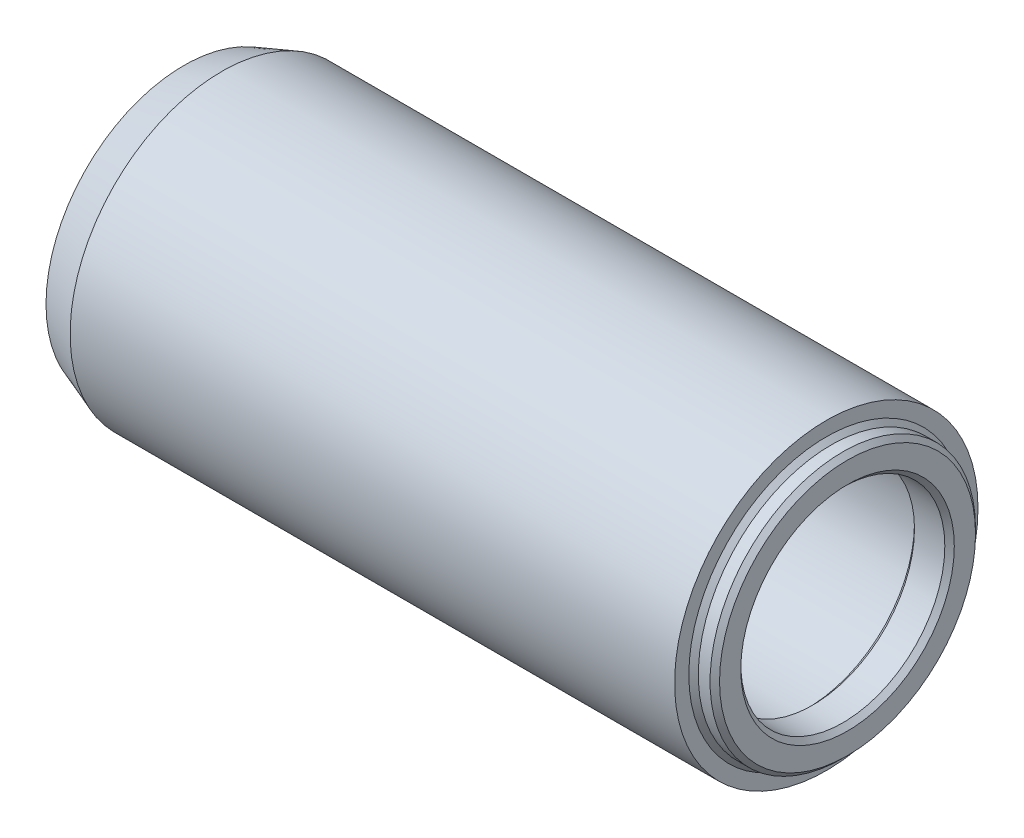
ISO-10303-21;
HEADER;
FILE_DESCRIPTION(('STEP AP214'),'2;1');
FILE_NAME('part.step','',(''),(''),'','','');
FILE_SCHEMA(('AUTOMOTIVE_DESIGN { 1 0 10303 214 1 1 1 1 }'));
ENDSEC;
DATA;
#1=APPLICATION_CONTEXT('core data for automotive mechanical design processes');
#2=APPLICATION_PROTOCOL_DEFINITION('international standard','automotive_design',2000,#1);
#3=PRODUCT_CONTEXT('',#1,'mechanical');
#4=PRODUCT('Part','Part','',(#3));
#5=PRODUCT_RELATED_PRODUCT_CATEGORY('part','',(#4));
#6=PRODUCT_DEFINITION_FORMATION('','',#4);
#7=PRODUCT_DEFINITION_CONTEXT('part definition',#1,'design');
#8=PRODUCT_DEFINITION('design','',#6,#7);
#9=PRODUCT_DEFINITION_SHAPE('','',#8);
#10=(LENGTH_UNIT() NAMED_UNIT(*) SI_UNIT(.MILLI.,.METRE.));
#11=(NAMED_UNIT(*) PLANE_ANGLE_UNIT() SI_UNIT($,.RADIAN.));
#12=(NAMED_UNIT(*) SI_UNIT($,.STERADIAN.) SOLID_ANGLE_UNIT());
#13=UNCERTAINTY_MEASURE_WITH_UNIT(LENGTH_MEASURE(1.E-05),#10,'distance_accuracy_value','');
#14=(GEOMETRIC_REPRESENTATION_CONTEXT(3) GLOBAL_UNCERTAINTY_ASSIGNED_CONTEXT((#13)) GLOBAL_UNIT_ASSIGNED_CONTEXT((#10,
#11,#12)) REPRESENTATION_CONTEXT('',''));
#15=CARTESIAN_POINT('',(0.,0.,0.));
#16=DIRECTION('',(0.,0.,1.));
#17=DIRECTION('',(1.,0.,0.));
#18=AXIS2_PLACEMENT_3D('',#15,#16,#17);
#19=CARTESIAN_POINT('',(-0.979823495601662,6.,0.));
#20=DIRECTION('',(-1.,0.,0.));
#21=DIRECTION('',(0.,0.,1.));
#22=AXIS2_PLACEMENT_3D('',#19,#20,#21);
#23=PLANE('',#22);
#24=CARTESIAN_POINT('',(-0.979823495601662,0.,0.));
#25=DIRECTION('',(-1.,0.,0.));
#26=DIRECTION('',(0.,0.,1.));
#27=AXIS2_PLACEMENT_3D('',#24,#25,#26);
#28=CIRCLE('',#27,5.75);
#29=CARTESIAN_POINT('',(-0.979823495601662,0.,5.75));
#30=VERTEX_POINT('',#29);
#31=EDGE_CURVE('E10',#30,#30,#28,.T.);
#32=ORIENTED_EDGE('',*,*,#31,.T.);
#33=EDGE_LOOP('',(#32));
#34=FACE_BOUND('',#33,.T.);
#35=CARTESIAN_POINT('',(-0.979823495601662,0.,0.));
#36=DIRECTION('',(-1.,0.,0.));
#37=DIRECTION('',(0.,0.,1.));
#38=AXIS2_PLACEMENT_3D('',#35,#36,#37);
#39=CIRCLE('',#38,5.6304532351823);
#40=CARTESIAN_POINT('',(-0.979823495601662,0.,5.6304532351823));
#41=VERTEX_POINT('',#40);
#42=EDGE_CURVE('E97',#41,#41,#39,.F.);
#43=ORIENTED_EDGE('',*,*,#42,.T.);
#44=EDGE_LOOP('',(#43));
#45=FACE_BOUND('',#44,.T.);
#46=ADVANCED_FACE('F43',(#34,#45),#23,.T.);
#47=CARTESIAN_POINT('',(0.,0.,0.));
#48=DIRECTION('',(1.,0.,0.));
#49=DIRECTION('',(0.,0.,-1.));
#50=AXIS2_PLACEMENT_3D('',#47,#48,#49);
#51=CYLINDRICAL_SURFACE('',#50,6.);
#52=CARTESIAN_POINT('',(-1.22982349560166,0.,0.));
#53=DIRECTION('',(-1.,0.,0.));
#54=DIRECTION('',(0.,0.,1.));
#55=AXIS2_PLACEMENT_3D('',#52,#53,#54);
#56=CIRCLE('',#55,6.);
#57=CARTESIAN_POINT('',(-1.22982349560166,0.,6.));
#58=VERTEX_POINT('',#57);
#59=EDGE_CURVE('E51',#58,#58,#56,.F.);
#60=ORIENTED_EDGE('',*,*,#59,.T.);
#61=EDGE_LOOP('',(#60));
#62=FACE_BOUND('',#61,.T.);
#63=CARTESIAN_POINT('',(-33.62745169,0.,0.));
#64=DIRECTION('',(-1.,0.,0.));
#65=DIRECTION('',(0.,0.,1.));
#66=AXIS2_PLACEMENT_3D('',#63,#64,#65);
#67=CIRCLE('',#66,6.);
#68=CARTESIAN_POINT('',(-33.62745169,0.,6.));
#69=VERTEX_POINT('',#68);
#70=EDGE_CURVE('E59',#69,#69,#67,.T.);
#71=ORIENTED_EDGE('',*,*,#70,.T.);
#72=EDGE_LOOP('',(#71));
#73=FACE_BOUND('',#72,.T.);
#74=ADVANCED_FACE('F134',(#62,#73),#51,.F.);
#75=CARTESIAN_POINT('',(-33.87745169,7.27205953146759,0.));
#76=DIRECTION('',(-1.,0.,0.));
#77=DIRECTION('',(0.,0.,1.));
#78=AXIS2_PLACEMENT_3D('',#75,#76,#77);
#79=PLANE('',#78);
#80=CARTESIAN_POINT('',(-33.87745169,0.,0.));
#81=DIRECTION('',(-1.,0.,0.));
#82=DIRECTION('',(0.,0.,1.));
#83=AXIS2_PLACEMENT_3D('',#80,#81,#82);
#84=CIRCLE('',#83,6.25);
#85=CARTESIAN_POINT('',(-33.87745169,0.,6.25));
#86=VERTEX_POINT('',#85);
#87=EDGE_CURVE('E65',#86,#86,#84,.F.);
#88=ORIENTED_EDGE('',*,*,#87,.T.);
#89=EDGE_LOOP('',(#88));
#90=FACE_BOUND('',#89,.T.);
#91=CARTESIAN_POINT('',(-33.87745169,0.,0.));
#92=DIRECTION('',(1.,0.,0.));
#93=DIRECTION('',(0.,0.,-1.));
#94=AXIS2_PLACEMENT_3D('',#91,#92,#93);
#95=CIRCLE('',#94,7.27205953146759);
#96=CARTESIAN_POINT('',(-33.87745169,0.,-7.27205953146759));
#97=VERTEX_POINT('',#96);
#98=EDGE_CURVE('E101',#97,#97,#95,.T.);
#99=ORIENTED_EDGE('',*,*,#98,.F.);
#100=EDGE_LOOP('',(#99));
#101=FACE_BOUND('',#100,.T.);
#102=ADVANCED_FACE('F130',(#90,#101),#79,.T.);
#103=CARTESIAN_POINT('',(-31.87745169,0.,0.));
#104=DIRECTION('',(1.,0.,0.));
#105=DIRECTION('',(0.,0.,-1.));
#106=AXIS2_PLACEMENT_3D('',#103,#104,#105);
#107=CONICAL_SURFACE('',#106,8.,0.349065850398867);
#108=ORIENTED_EDGE('',*,*,#98,.T.);
#109=EDGE_LOOP('',(#108));
#110=FACE_BOUND('',#109,.T.);
#111=CARTESIAN_POINT('',(-31.87745169,0.,0.));
#112=DIRECTION('',(1.,0.,0.));
#113=DIRECTION('',(0.,0.,-1.));
#114=AXIS2_PLACEMENT_3D('',#111,#112,#113);
#115=CIRCLE('',#114,8.);
#116=CARTESIAN_POINT('',(-31.87745169,0.,-8.));
#117=VERTEX_POINT('',#116);
#118=EDGE_CURVE('E105',#117,#117,#115,.T.);
#119=ORIENTED_EDGE('',*,*,#118,.F.);
#120=EDGE_LOOP('',(#119));
#121=FACE_BOUND('',#120,.T.);
#122=ADVANCED_FACE('F119',(#110,#121),#107,.T.);
#123=CARTESIAN_POINT('',(0.,0.,0.));
#124=DIRECTION('',(1.,0.,0.));
#125=DIRECTION('',(0.,0.,-1.));
#126=AXIS2_PLACEMENT_3D('',#123,#124,#125);
#127=CYLINDRICAL_SURFACE('',#126,8.);
#128=ORIENTED_EDGE('',*,*,#118,.T.);
#129=EDGE_LOOP('',(#128));
#130=FACE_BOUND('',#129,.T.);
#131=CARTESIAN_POINT('',(0.,0.,0.));
#132=DIRECTION('',(1.,0.,0.));
#133=DIRECTION('',(0.,0.,-1.));
#134=AXIS2_PLACEMENT_3D('',#131,#132,#133);
#135=CIRCLE('',#134,8.);
#136=CARTESIAN_POINT('',(0.,0.,-8.));
#137=VERTEX_POINT('',#136);
#138=EDGE_CURVE('E109',#137,#137,#135,.T.);
#139=ORIENTED_EDGE('',*,*,#138,.F.);
#140=EDGE_LOOP('',(#139));
#141=FACE_BOUND('',#140,.T.);
#142=ADVANCED_FACE('F117',(#130,#141),#127,.T.);
#143=CARTESIAN_POINT('',(0.,8.,0.));
#144=DIRECTION('',(1.,0.,0.));
#145=DIRECTION('',(0.,0.,-1.));
#146=AXIS2_PLACEMENT_3D('',#143,#144,#145);
#147=PLANE('',#146);
#148=CARTESIAN_POINT('',(0.,0.,0.));
#149=DIRECTION('',(1.,0.,0.));
#150=DIRECTION('',(0.,0.,-1.));
#151=AXIS2_PLACEMENT_3D('',#148,#149,#150);
#152=CIRCLE('',#151,7.25);
#153=CARTESIAN_POINT('',(0.,0.,-7.25));
#154=VERTEX_POINT('',#153);
#155=EDGE_CURVE('E70',#154,#154,#152,.F.);
#156=ORIENTED_EDGE('',*,*,#155,.T.);
#157=EDGE_LOOP('',(#156));
#158=FACE_BOUND('',#157,.T.);
#159=ORIENTED_EDGE('',*,*,#138,.T.);
#160=EDGE_LOOP('',(#159));
#161=FACE_BOUND('',#160,.T.);
#162=ADVANCED_FACE('F115',(#158,#161),#147,.T.);
#163=CARTESIAN_POINT('',(0.,0.,0.));
#164=DIRECTION('',(1.,0.,0.));
#165=DIRECTION('',(0.,0.,-1.));
#166=AXIS2_PLACEMENT_3D('',#163,#164,#165);
#167=CYLINDRICAL_SURFACE('',#166,7.);
#168=CARTESIAN_POINT('',(0.869965147070844,0.,0.));
#169=DIRECTION('',(1.,0.,0.));
#170=DIRECTION('',(0.,0.,-1.));
#171=AXIS2_PLACEMENT_3D('',#168,#169,#170);
#172=CIRCLE('',#171,7.);
#173=CARTESIAN_POINT('',(0.869965147070844,0.,-7.));
#174=VERTEX_POINT('',#173);
#175=EDGE_CURVE('E74',#174,#174,#172,.F.);
#176=ORIENTED_EDGE('',*,*,#175,.T.);
#177=EDGE_LOOP('',(#176));
#178=FACE_BOUND('',#177,.T.);
#179=CARTESIAN_POINT('',(0.250000000000003,0.,0.));
#180=DIRECTION('',(1.,0.,0.));
#181=DIRECTION('',(0.,0.,-1.));
#182=AXIS2_PLACEMENT_3D('',#179,#180,#181);
#183=CIRCLE('',#182,7.);
#184=CARTESIAN_POINT('',(0.250000000000003,0.,-7.));
#185=VERTEX_POINT('',#184);
#186=EDGE_CURVE('E77',#185,#185,#183,.T.);
#187=ORIENTED_EDGE('',*,*,#186,.T.);
#188=EDGE_LOOP('',(#187));
#189=FACE_BOUND('',#188,.T.);
#190=ADVANCED_FACE('F127',(#178,#189),#167,.T.);
#191=CARTESIAN_POINT('',(1.11996514707084,7.,0.));
#192=DIRECTION('',(1.,0.,0.));
#193=DIRECTION('',(0.,0.,-1.));
#194=AXIS2_PLACEMENT_3D('',#191,#192,#193);
#195=PLANE('',#194);
#196=CARTESIAN_POINT('',(1.11996514707084,0.,0.));
#197=DIRECTION('',(1.,0.,0.));
#198=DIRECTION('',(0.,0.,-1.));
#199=AXIS2_PLACEMENT_3D('',#196,#197,#198);
#200=CIRCLE('',#199,5.6304532351823);
#201=CARTESIAN_POINT('',(1.11996514707084,0.,-5.6304532351823));
#202=VERTEX_POINT('',#201);
#203=EDGE_CURVE('E81',#202,#202,#200,.F.);
#204=ORIENTED_EDGE('',*,*,#203,.T.);
#205=EDGE_LOOP('',(#204));
#206=FACE_BOUND('',#205,.T.);
#207=CARTESIAN_POINT('',(1.11996514707084,0.,0.));
#208=DIRECTION('',(1.,0.,0.));
#209=DIRECTION('',(0.,0.,-1.));
#210=AXIS2_PLACEMENT_3D('',#207,#208,#209);
#211=CIRCLE('',#210,6.75);
#212=CARTESIAN_POINT('',(1.11996514707084,0.,-6.75));
#213=VERTEX_POINT('',#212);
#214=EDGE_CURVE('E85',#213,#213,#211,.T.);
#215=ORIENTED_EDGE('',*,*,#214,.T.);
#216=EDGE_LOOP('',(#215));
#217=FACE_BOUND('',#216,.T.);
#218=ADVANCED_FACE('F205',(#206,#217),#195,.T.);
#219=CARTESIAN_POINT('',(0.,0.,0.));
#220=DIRECTION('',(1.,0.,0.));
#221=DIRECTION('',(0.,0.,-1.));
#222=AXIS2_PLACEMENT_3D('',#219,#220,#221);
#223=CYLINDRICAL_SURFACE('',#222,5.3804532351823);
#224=CARTESIAN_POINT('',(-0.729823495601656,0.,0.));
#225=DIRECTION('',(-1.,0.,0.));
#226=DIRECTION('',(0.,0.,1.));
#227=AXIS2_PLACEMENT_3D('',#224,#225,#226);
#228=CIRCLE('',#227,5.3804532351823);
#229=CARTESIAN_POINT('',(-0.729823495601656,0.,5.3804532351823));
#230=VERTEX_POINT('',#229);
#231=EDGE_CURVE('E89',#230,#230,#228,.T.);
#232=ORIENTED_EDGE('',*,*,#231,.T.);
#233=EDGE_LOOP('',(#232));
#234=FACE_BOUND('',#233,.T.);
#235=CARTESIAN_POINT('',(0.869965147070835,0.,0.));
#236=DIRECTION('',(1.,0.,0.));
#237=DIRECTION('',(0.,0.,-1.));
#238=AXIS2_PLACEMENT_3D('',#235,#236,#237);
#239=CIRCLE('',#238,5.3804532351823);
#240=CARTESIAN_POINT('',(0.869965147070835,0.,-5.3804532351823));
#241=VERTEX_POINT('',#240);
#242=EDGE_CURVE('E93',#241,#241,#239,.T.);
#243=ORIENTED_EDGE('',*,*,#242,.T.);
#244=EDGE_LOOP('',(#243));
#245=FACE_BOUND('',#244,.T.);
#246=ADVANCED_FACE('F152',(#234,#245),#223,.F.);
#247=CARTESIAN_POINT('',(-0.979823495601662,0.,0.));
#248=DIRECTION('',(-1.,0.,0.));
#249=DIRECTION('',(0.,0.,1.));
#250=AXIS2_PLACEMENT_3D('',#247,#248,#249);
#251=CONICAL_SURFACE('',#250,5.6304532351823,0.78539816339745);
#252=ORIENTED_EDGE('',*,*,#231,.F.);
#253=EDGE_LOOP('',(#252));
#254=FACE_BOUND('',#253,.T.);
#255=ORIENTED_EDGE('',*,*,#42,.F.);
#256=EDGE_LOOP('',(#255));
#257=FACE_BOUND('',#256,.T.);
#258=ADVANCED_FACE('F145',(#254,#257),#251,.F.);
#259=CARTESIAN_POINT('',(0.869965147070835,0.,0.));
#260=DIRECTION('',(1.,0.,0.));
#261=DIRECTION('',(0.,0.,-1.));
#262=AXIS2_PLACEMENT_3D('',#259,#260,#261);
#263=CONICAL_SURFACE('',#262,5.3804532351823,0.78539816339744);
#264=ORIENTED_EDGE('',*,*,#203,.F.);
#265=EDGE_LOOP('',(#264));
#266=FACE_BOUND('',#265,.T.);
#267=ORIENTED_EDGE('',*,*,#242,.F.);
#268=EDGE_LOOP('',(#267));
#269=FACE_BOUND('',#268,.T.);
#270=ADVANCED_FACE('F151',(#266,#269),#263,.F.);
#271=CARTESIAN_POINT('',(1.11996514707084,0.,0.));
#272=DIRECTION('',(-1.,0.,0.));
#273=DIRECTION('',(0.,0.,1.));
#274=AXIS2_PLACEMENT_3D('',#271,#272,#273);
#275=CONICAL_SURFACE('',#274,6.75,0.785398163397462);
#276=ORIENTED_EDGE('',*,*,#175,.F.);
#277=EDGE_LOOP('',(#276));
#278=FACE_BOUND('',#277,.T.);
#279=ORIENTED_EDGE('',*,*,#214,.F.);
#280=EDGE_LOOP('',(#279));
#281=FACE_BOUND('',#280,.T.);
#282=ADVANCED_FACE('F159',(#278,#281),#275,.T.);
#283=CARTESIAN_POINT('',(0.250000000000003,0.,0.));
#284=DIRECTION('',(-1.,0.,0.));
#285=DIRECTION('',(0.,0.,1.));
#286=AXIS2_PLACEMENT_3D('',#283,#284,#285);
#287=CONICAL_SURFACE('',#286,7.,0.78539816339744);
#288=ORIENTED_EDGE('',*,*,#155,.F.);
#289=EDGE_LOOP('',(#288));
#290=FACE_BOUND('',#289,.T.);
#291=ORIENTED_EDGE('',*,*,#186,.F.);
#292=EDGE_LOOP('',(#291));
#293=FACE_BOUND('',#292,.T.);
#294=ADVANCED_FACE('F166',(#290,#293),#287,.T.);
#295=CARTESIAN_POINT('',(-33.87745169,0.,0.));
#296=DIRECTION('',(-1.,0.,0.));
#297=DIRECTION('',(0.,0.,1.));
#298=AXIS2_PLACEMENT_3D('',#295,#296,#297);
#299=CONICAL_SURFACE('',#298,6.25,0.785398163397436);
#300=ORIENTED_EDGE('',*,*,#70,.F.);
#301=EDGE_LOOP('',(#300));
#302=FACE_BOUND('',#301,.T.);
#303=ORIENTED_EDGE('',*,*,#87,.F.);
#304=EDGE_LOOP('',(#303));
#305=FACE_BOUND('',#304,.T.);
#306=ADVANCED_FACE('F172',(#302,#305),#299,.F.);
#307=CARTESIAN_POINT('',(-1.22982349560166,0.,0.));
#308=DIRECTION('',(-1.,0.,0.));
#309=DIRECTION('',(0.,0.,1.));
#310=AXIS2_PLACEMENT_3D('',#307,#308,#309);
#311=TOROIDAL_SURFACE('',#310,5.75,0.25);
#312=ORIENTED_EDGE('',*,*,#31,.F.);
#313=EDGE_LOOP('',(#312));
#314=FACE_BOUND('',#313,.T.);
#315=ORIENTED_EDGE('',*,*,#59,.F.);
#316=EDGE_LOOP('',(#315));
#317=FACE_BOUND('',#316,.T.);
#318=ADVANCED_FACE('F45',(#314,#317),#311,.F.);
#319=CLOSED_SHELL('',(#46,#74,#102,#122,#142,#162,#190,#218,#246,#258,#270,#282,#294,#306,#318));
#320=MANIFOLD_SOLID_BREP('B2',#319);
#321=ADVANCED_BREP_SHAPE_REPRESENTATION('',(#18,#320),#14);
#322=SHAPE_DEFINITION_REPRESENTATION(#9,#321);
ENDSEC;
END-ISO-10303-21;
